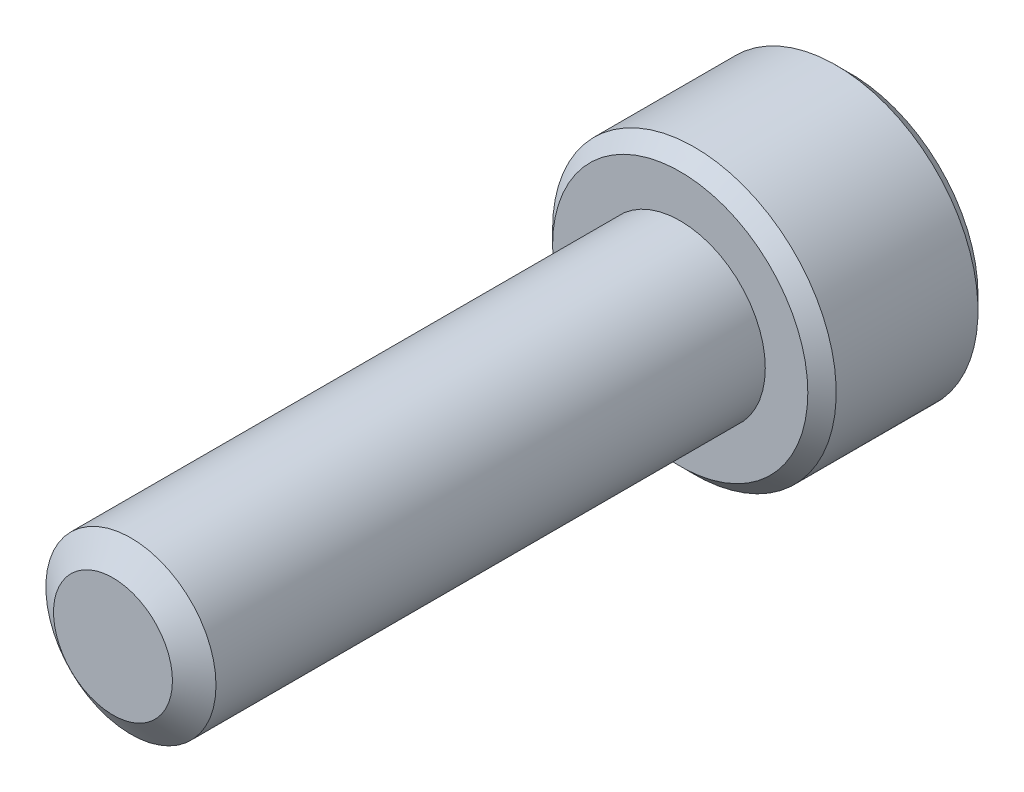
ISO-10303-21;
HEADER;
FILE_DESCRIPTION(('STEP AP214'),'2;1');
FILE_NAME('part.step','',(''),(''),'','','');
FILE_SCHEMA(('AUTOMOTIVE_DESIGN { 1 0 10303 214 1 1 1 1 }'));
ENDSEC;
DATA;
#1=APPLICATION_CONTEXT('core data for automotive mechanical design processes');
#2=APPLICATION_PROTOCOL_DEFINITION('international standard','automotive_design',2000,#1);
#3=PRODUCT_CONTEXT('',#1,'mechanical');
#4=PRODUCT('Part','Part','',(#3));
#5=PRODUCT_RELATED_PRODUCT_CATEGORY('part','',(#4));
#6=PRODUCT_DEFINITION_FORMATION('','',#4);
#7=PRODUCT_DEFINITION_CONTEXT('part definition',#1,'design');
#8=PRODUCT_DEFINITION('design','',#6,#7);
#9=PRODUCT_DEFINITION_SHAPE('','',#8);
#10=(LENGTH_UNIT() NAMED_UNIT(*) SI_UNIT(.MILLI.,.METRE.));
#11=(NAMED_UNIT(*) PLANE_ANGLE_UNIT() SI_UNIT($,.RADIAN.));
#12=(NAMED_UNIT(*) SI_UNIT($,.STERADIAN.) SOLID_ANGLE_UNIT());
#13=UNCERTAINTY_MEASURE_WITH_UNIT(LENGTH_MEASURE(1.E-05),#10,'distance_accuracy_value','');
#14=(GEOMETRIC_REPRESENTATION_CONTEXT(3) GLOBAL_UNCERTAINTY_ASSIGNED_CONTEXT((#13)) GLOBAL_UNIT_ASSIGNED_CONTEXT((#10,
#11,#12)) REPRESENTATION_CONTEXT('',''));
#15=CARTESIAN_POINT('',(0.,0.,0.));
#16=DIRECTION('',(0.,0.,1.));
#17=DIRECTION('',(1.,0.,0.));
#18=AXIS2_PLACEMENT_3D('',#15,#16,#17);
#19=CARTESIAN_POINT('',(0.,0.,-20.));
#20=DIRECTION('',(0.,0.,1.));
#21=DIRECTION('',(1.,0.,0.));
#22=AXIS2_PLACEMENT_3D('',#19,#20,#21);
#23=CYLINDRICAL_SURFACE('',#22,3.);
#24=CARTESIAN_POINT('',(0.,0.,-20.));
#25=DIRECTION('',(0.,0.,-1.));
#26=DIRECTION('',(-1.,0.,0.));
#27=AXIS2_PLACEMENT_3D('',#24,#25,#26);
#28=CIRCLE('',#27,3.);
#29=CARTESIAN_POINT('',(-3.,0.,-20.));
#30=VERTEX_POINT('',#29);
#31=EDGE_CURVE('E154',#30,#30,#28,.F.);
#32=ORIENTED_EDGE('',*,*,#31,.T.);
#33=EDGE_LOOP('',(#32));
#34=FACE_BOUND('',#33,.T.);
#35=CARTESIAN_POINT('',(0.,0.,-0.632650851713494));
#36=DIRECTION('',(0.,0.,1.));
#37=DIRECTION('',(1.,0.,0.));
#38=AXIS2_PLACEMENT_3D('',#35,#36,#37);
#39=CIRCLE('',#38,3.);
#40=CARTESIAN_POINT('',(3.,0.,-0.632650851713494));
#41=VERTEX_POINT('',#40);
#42=EDGE_CURVE('E171',#41,#41,#39,.T.);
#43=ORIENTED_EDGE('',*,*,#42,.F.);
#44=EDGE_LOOP('',(#43));
#45=FACE_BOUND('',#44,.T.);
#46=ADVANCED_FACE('F39',(#34,#45),#23,.T.);
#47=CARTESIAN_POINT('',(0.,0.,0.));
#48=DIRECTION('',(0.,0.,-1.));
#49=DIRECTION('',(-1.,0.,0.));
#50=AXIS2_PLACEMENT_3D('',#47,#48,#49);
#51=CONICAL_SURFACE('',#50,2.09648094716167,0.959931088596884);
#52=ORIENTED_EDGE('',*,*,#42,.T.);
#53=EDGE_LOOP('',(#52));
#54=FACE_BOUND('',#53,.T.);
#55=CARTESIAN_POINT('',(0.,0.,0.));
#56=DIRECTION('',(0.,0.,1.));
#57=DIRECTION('',(1.,0.,0.));
#58=AXIS2_PLACEMENT_3D('',#55,#56,#57);
#59=CIRCLE('',#58,2.09648094716167);
#60=CARTESIAN_POINT('',(2.09648094716167,0.,0.));
#61=VERTEX_POINT('',#60);
#62=EDGE_CURVE('E167',#61,#61,#59,.T.);
#63=ORIENTED_EDGE('',*,*,#62,.F.);
#64=EDGE_LOOP('',(#63));
#65=FACE_BOUND('',#64,.T.);
#66=ADVANCED_FACE('F220',(#54,#65),#51,.T.);
#67=CARTESIAN_POINT('',(0.,0.,0.));
#68=DIRECTION('',(0.,0.,1.));
#69=DIRECTION('',(1.,0.,0.));
#70=AXIS2_PLACEMENT_3D('',#67,#68,#69);
#71=PLANE('',#70);
#72=ORIENTED_EDGE('',*,*,#62,.T.);
#73=EDGE_LOOP('',(#72));
#74=FACE_BOUND('',#73,.T.);
#75=ADVANCED_FACE('F226',(#74),#71,.T.);
#76=CARTESIAN_POINT('',(0.,0.,-26.));
#77=DIRECTION('',(0.,0.,1.));
#78=DIRECTION('',(1.,0.,0.));
#79=AXIS2_PLACEMENT_3D('',#76,#77,#78);
#80=CYLINDRICAL_SURFACE('',#79,5.);
#81=CARTESIAN_POINT('',(0.,0.,-25.5));
#82=DIRECTION('',(0.,0.,-1.));
#83=DIRECTION('',(-1.,0.,0.));
#84=AXIS2_PLACEMENT_3D('',#81,#82,#83);
#85=CIRCLE('',#84,5.);
#86=CARTESIAN_POINT('',(-5.,0.,-25.5));
#87=VERTEX_POINT('',#86);
#88=EDGE_CURVE('E48',#87,#87,#85,.F.);
#89=ORIENTED_EDGE('',*,*,#88,.T.);
#90=EDGE_LOOP('',(#89));
#91=FACE_BOUND('',#90,.T.);
#92=CARTESIAN_POINT('',(0.,0.,-20.5));
#93=DIRECTION('',(0.,0.,-1.));
#94=DIRECTION('',(-1.,0.,0.));
#95=AXIS2_PLACEMENT_3D('',#92,#93,#94);
#96=CIRCLE('',#95,5.);
#97=CARTESIAN_POINT('',(-5.,0.,-20.5));
#98=VERTEX_POINT('',#97);
#99=EDGE_CURVE('E179',#98,#98,#96,.T.);
#100=ORIENTED_EDGE('',*,*,#99,.T.);
#101=EDGE_LOOP('',(#100));
#102=FACE_BOUND('',#101,.T.);
#103=ADVANCED_FACE('F186',(#91,#102),#80,.T.);
#104=CARTESIAN_POINT('',(0.,0.,-26.));
#105=DIRECTION('',(0.,0.,-1.));
#106=DIRECTION('',(-1.,0.,0.));
#107=AXIS2_PLACEMENT_3D('',#104,#105,#106);
#108=PLANE('',#107);
#109=CARTESIAN_POINT('',(0.,0.,-26.));
#110=DIRECTION('',(0.,0.,-1.));
#111=DIRECTION('',(-1.,0.,0.));
#112=AXIS2_PLACEMENT_3D('',#109,#110,#111);
#113=CIRCLE('',#112,4.5);
#114=CARTESIAN_POINT('',(-4.5,0.,-26.));
#115=VERTEX_POINT('',#114);
#116=EDGE_CURVE('E175',#115,#115,#113,.T.);
#117=ORIENTED_EDGE('',*,*,#116,.T.);
#118=EDGE_LOOP('',(#117));
#119=FACE_BOUND('',#118,.T.);
#120=DIRECTION('',(0.866025403784439,0.5,0.));
#121=VECTOR('',#120,1.);
#122=CARTESIAN_POINT('',(-2.5,1.44337567297406,-26.));
#123=LINE('',#122,#121);
#124=CARTESIAN_POINT('',(-2.5,1.44337567297406,-26.));
#125=VERTEX_POINT('',#124);
#126=CARTESIAN_POINT('',(0.,2.88675134594813,-26.));
#127=VERTEX_POINT('',#126);
#128=EDGE_CURVE('E55',#125,#127,#123,.T.);
#129=ORIENTED_EDGE('',*,*,#128,.F.);
#130=DIRECTION('',(0.,1.,0.));
#131=VECTOR('',#130,1.);
#132=CARTESIAN_POINT('',(-2.5,-1.44337567297406,-26.));
#133=LINE('',#132,#131);
#134=CARTESIAN_POINT('',(-2.5,-1.44337567297406,-26.));
#135=VERTEX_POINT('',#134);
#136=EDGE_CURVE('E148',#135,#125,#133,.T.);
#137=ORIENTED_EDGE('',*,*,#136,.F.);
#138=DIRECTION('',(-0.866025403784439,0.5,0.));
#139=VECTOR('',#138,1.);
#140=CARTESIAN_POINT('',(0.,-2.88675134594813,-26.));
#141=LINE('',#140,#139);
#142=CARTESIAN_POINT('',(0.,-2.88675134594813,-26.));
#143=VERTEX_POINT('',#142);
#144=EDGE_CURVE('E145',#143,#135,#141,.T.);
#145=ORIENTED_EDGE('',*,*,#144,.F.);
#146=DIRECTION('',(-0.866025403784439,-0.5,0.));
#147=VECTOR('',#146,1.);
#148=CARTESIAN_POINT('',(2.5,-1.44337567297407,-26.));
#149=LINE('',#148,#147);
#150=CARTESIAN_POINT('',(2.5,-1.44337567297407,-26.));
#151=VERTEX_POINT('',#150);
#152=EDGE_CURVE('E103',#151,#143,#149,.T.);
#153=ORIENTED_EDGE('',*,*,#152,.F.);
#154=DIRECTION('',(0.,-1.,0.));
#155=VECTOR('',#154,1.);
#156=CARTESIAN_POINT('',(2.5,1.44337567297406,-26.));
#157=LINE('',#156,#155);
#158=CARTESIAN_POINT('',(2.5,1.44337567297406,-26.));
#159=VERTEX_POINT('',#158);
#160=EDGE_CURVE('E139',#159,#151,#157,.T.);
#161=ORIENTED_EDGE('',*,*,#160,.F.);
#162=DIRECTION('',(0.866025403784439,-0.5,0.));
#163=VECTOR('',#162,1.);
#164=CARTESIAN_POINT('',(0.,2.88675134594813,-26.));
#165=LINE('',#164,#163);
#166=EDGE_CURVE('E135',#127,#159,#165,.T.);
#167=ORIENTED_EDGE('',*,*,#166,.F.);
#168=EDGE_LOOP('',(#129,#137,#145,#153,#161,#167));
#169=FACE_BOUND('',#168,.T.);
#170=ADVANCED_FACE('F194',(#119,#169),#108,.T.);
#171=CARTESIAN_POINT('',(0.,0.,-20.));
#172=DIRECTION('',(0.,0.,-1.));
#173=DIRECTION('',(-1.,0.,0.));
#174=AXIS2_PLACEMENT_3D('',#171,#172,#173);
#175=PLANE('',#174);
#176=CARTESIAN_POINT('',(0.,0.,-20.));
#177=DIRECTION('',(0.,0.,-1.));
#178=DIRECTION('',(-1.,0.,0.));
#179=AXIS2_PLACEMENT_3D('',#176,#177,#178);
#180=CIRCLE('',#179,4.5);
#181=CARTESIAN_POINT('',(-4.5,0.,-20.));
#182=VERTEX_POINT('',#181);
#183=EDGE_CURVE('E11',#182,#182,#180,.F.);
#184=ORIENTED_EDGE('',*,*,#183,.T.);
#185=EDGE_LOOP('',(#184));
#186=FACE_BOUND('',#185,.T.);
#187=ORIENTED_EDGE('',*,*,#31,.F.);
#188=EDGE_LOOP('',(#187));
#189=FACE_BOUND('',#188,.T.);
#190=ADVANCED_FACE('F197',(#186,#189),#175,.F.);
#191=CARTESIAN_POINT('',(-2.5,1.44337567297406,-22.25));
#192=DIRECTION('',(-0.5,0.866025403784439,0.));
#193=DIRECTION('',(-0.866025403784439,-0.5,0.));
#194=AXIS2_PLACEMENT_3D('',#191,#192,#193);
#195=PLANE('',#194);
#196=ORIENTED_EDGE('',*,*,#128,.T.);
#197=DIRECTION('',(0.,0.,-1.));
#198=VECTOR('',#197,1.);
#199=CARTESIAN_POINT('',(0.,2.88675134594813,-22.25));
#200=LINE('',#199,#198);
#201=CARTESIAN_POINT('',(0.,2.88675134594813,-22.25));
#202=VERTEX_POINT('',#201);
#203=EDGE_CURVE('E85',#202,#127,#200,.T.);
#204=ORIENTED_EDGE('',*,*,#203,.F.);
#205=DIRECTION('',(0.866025403784439,0.5,0.));
#206=VECTOR('',#205,1.);
#207=CARTESIAN_POINT('',(-2.5,1.44337567297406,-22.25));
#208=LINE('',#207,#206);
#209=CARTESIAN_POINT('',(-2.5,1.44337567297406,-22.25));
#210=VERTEX_POINT('',#209);
#211=EDGE_CURVE('E151',#210,#202,#208,.T.);
#212=ORIENTED_EDGE('',*,*,#211,.F.);
#213=DIRECTION('',(0.,0.,-1.));
#214=VECTOR('',#213,1.);
#215=CARTESIAN_POINT('',(-2.5,1.44337567297406,-22.25));
#216=LINE('',#215,#214);
#217=EDGE_CURVE('E63',#210,#125,#216,.T.);
#218=ORIENTED_EDGE('',*,*,#217,.T.);
#219=EDGE_LOOP('',(#196,#204,#212,#218));
#220=FACE_BOUND('',#219,.T.);
#221=ADVANCED_FACE('F207',(#220),#195,.F.);
#222=CARTESIAN_POINT('',(-2.5,-1.44337567297406,-22.25));
#223=DIRECTION('',(-1.,0.,0.));
#224=DIRECTION('',(0.,-1.,0.));
#225=AXIS2_PLACEMENT_3D('',#222,#223,#224);
#226=PLANE('',#225);
#227=ORIENTED_EDGE('',*,*,#136,.T.);
#228=ORIENTED_EDGE('',*,*,#217,.F.);
#229=DIRECTION('',(0.,1.,0.));
#230=VECTOR('',#229,1.);
#231=CARTESIAN_POINT('',(-2.5,-1.44337567297406,-22.25));
#232=LINE('',#231,#230);
#233=CARTESIAN_POINT('',(-2.5,-1.44337567297406,-22.25));
#234=VERTEX_POINT('',#233);
#235=EDGE_CURVE('E117',#234,#210,#232,.T.);
#236=ORIENTED_EDGE('',*,*,#235,.F.);
#237=DIRECTION('',(0.,0.,-1.));
#238=VECTOR('',#237,1.);
#239=CARTESIAN_POINT('',(-2.5,-1.44337567297406,-22.25));
#240=LINE('',#239,#238);
#241=EDGE_CURVE('E108',#234,#135,#240,.T.);
#242=ORIENTED_EDGE('',*,*,#241,.T.);
#243=EDGE_LOOP('',(#227,#228,#236,#242));
#244=FACE_BOUND('',#243,.T.);
#245=ADVANCED_FACE('F209',(#244),#226,.F.);
#246=CARTESIAN_POINT('',(0.,-2.88675134594813,-22.25));
#247=DIRECTION('',(-0.5,-0.866025403784439,0.));
#248=DIRECTION('',(0.866025403784439,-0.5,0.));
#249=AXIS2_PLACEMENT_3D('',#246,#247,#248);
#250=PLANE('',#249);
#251=ORIENTED_EDGE('',*,*,#144,.T.);
#252=ORIENTED_EDGE('',*,*,#241,.F.);
#253=DIRECTION('',(-0.866025403784439,0.5,0.));
#254=VECTOR('',#253,1.);
#255=CARTESIAN_POINT('',(0.,-2.88675134594813,-22.25));
#256=LINE('',#255,#254);
#257=CARTESIAN_POINT('',(0.,-2.88675134594813,-22.25));
#258=VERTEX_POINT('',#257);
#259=EDGE_CURVE('E112',#258,#234,#256,.T.);
#260=ORIENTED_EDGE('',*,*,#259,.F.);
#261=DIRECTION('',(0.,0.,-1.));
#262=VECTOR('',#261,1.);
#263=CARTESIAN_POINT('',(0.,-2.88675134594813,-22.25));
#264=LINE('',#263,#262);
#265=EDGE_CURVE('E96',#258,#143,#264,.T.);
#266=ORIENTED_EDGE('',*,*,#265,.T.);
#267=EDGE_LOOP('',(#251,#252,#260,#266));
#268=FACE_BOUND('',#267,.T.);
#269=ADVANCED_FACE('F113',(#268),#250,.F.);
#270=CARTESIAN_POINT('',(2.5,-1.44337567297407,-22.25));
#271=DIRECTION('',(0.5,-0.866025403784439,0.));
#272=DIRECTION('',(0.866025403784439,0.5,0.));
#273=AXIS2_PLACEMENT_3D('',#270,#271,#272);
#274=PLANE('',#273);
#275=ORIENTED_EDGE('',*,*,#152,.T.);
#276=ORIENTED_EDGE('',*,*,#265,.F.);
#277=DIRECTION('',(-0.866025403784439,-0.5,0.));
#278=VECTOR('',#277,1.);
#279=CARTESIAN_POINT('',(2.5,-1.44337567297407,-22.25));
#280=LINE('',#279,#278);
#281=CARTESIAN_POINT('',(2.5,-1.44337567297407,-22.25));
#282=VERTEX_POINT('',#281);
#283=EDGE_CURVE('E100',#282,#258,#280,.T.);
#284=ORIENTED_EDGE('',*,*,#283,.F.);
#285=DIRECTION('',(0.,0.,-1.));
#286=VECTOR('',#285,1.);
#287=CARTESIAN_POINT('',(2.5,-1.44337567297407,-22.25));
#288=LINE('',#287,#286);
#289=EDGE_CURVE('E109',#282,#151,#288,.T.);
#290=ORIENTED_EDGE('',*,*,#289,.T.);
#291=EDGE_LOOP('',(#275,#276,#284,#290));
#292=FACE_BOUND('',#291,.T.);
#293=ADVANCED_FACE('F98',(#292),#274,.F.);
#294=CARTESIAN_POINT('',(2.5,1.44337567297406,-22.25));
#295=DIRECTION('',(1.,0.,0.));
#296=DIRECTION('',(0.,0.,-1.));
#297=AXIS2_PLACEMENT_3D('',#294,#295,#296);
#298=PLANE('',#297);
#299=ORIENTED_EDGE('',*,*,#160,.T.);
#300=ORIENTED_EDGE('',*,*,#289,.F.);
#301=DIRECTION('',(0.,-1.,0.));
#302=VECTOR('',#301,1.);
#303=CARTESIAN_POINT('',(2.5,1.44337567297406,-22.25));
#304=LINE('',#303,#302);
#305=CARTESIAN_POINT('',(2.5,1.44337567297406,-22.25));
#306=VERTEX_POINT('',#305);
#307=EDGE_CURVE('E123',#306,#282,#304,.T.);
#308=ORIENTED_EDGE('',*,*,#307,.F.);
#309=DIRECTION('',(0.,0.,-1.));
#310=VECTOR('',#309,1.);
#311=CARTESIAN_POINT('',(2.5,1.44337567297406,-22.25));
#312=LINE('',#311,#310);
#313=EDGE_CURVE('E159',#306,#159,#312,.T.);
#314=ORIENTED_EDGE('',*,*,#313,.T.);
#315=EDGE_LOOP('',(#299,#300,#308,#314));
#316=FACE_BOUND('',#315,.T.);
#317=ADVANCED_FACE('F281',(#316),#298,.F.);
#318=CARTESIAN_POINT('',(0.,2.88675134594813,-22.25));
#319=DIRECTION('',(0.5,0.866025403784439,0.));
#320=DIRECTION('',(-0.866025403784439,0.5,0.));
#321=AXIS2_PLACEMENT_3D('',#318,#319,#320);
#322=PLANE('',#321);
#323=ORIENTED_EDGE('',*,*,#166,.T.);
#324=ORIENTED_EDGE('',*,*,#313,.F.);
#325=DIRECTION('',(0.866025403784439,-0.5,0.));
#326=VECTOR('',#325,1.);
#327=CARTESIAN_POINT('',(0.,2.88675134594813,-22.25));
#328=LINE('',#327,#326);
#329=EDGE_CURVE('E127',#202,#306,#328,.T.);
#330=ORIENTED_EDGE('',*,*,#329,.F.);
#331=ORIENTED_EDGE('',*,*,#203,.T.);
#332=EDGE_LOOP('',(#323,#324,#330,#331));
#333=FACE_BOUND('',#332,.T.);
#334=ADVANCED_FACE('F203',(#333),#322,.F.);
#335=CARTESIAN_POINT('',(2.5,4.33012701892219,-22.25));
#336=DIRECTION('',(0.,0.,-1.));
#337=DIRECTION('',(-1.,0.,0.));
#338=AXIS2_PLACEMENT_3D('',#335,#336,#337);
#339=PLANE('',#338);
#340=ORIENTED_EDGE('',*,*,#211,.T.);
#341=ORIENTED_EDGE('',*,*,#329,.T.);
#342=ORIENTED_EDGE('',*,*,#307,.T.);
#343=ORIENTED_EDGE('',*,*,#283,.T.);
#344=ORIENTED_EDGE('',*,*,#259,.T.);
#345=ORIENTED_EDGE('',*,*,#235,.T.);
#346=EDGE_LOOP('',(#340,#341,#342,#343,#344,#345));
#347=FACE_BOUND('',#346,.T.);
#348=ADVANCED_FACE('F120',(#347),#339,.T.);
#349=CARTESIAN_POINT('',(0.,0.,-26.));
#350=DIRECTION('',(0.,0.,1.));
#351=DIRECTION('',(1.,0.,0.));
#352=AXIS2_PLACEMENT_3D('',#349,#350,#351);
#353=CONICAL_SURFACE('',#352,4.5,0.785398163397444);
#354=ORIENTED_EDGE('',*,*,#88,.F.);
#355=EDGE_LOOP('',(#354));
#356=FACE_BOUND('',#355,.T.);
#357=ORIENTED_EDGE('',*,*,#116,.F.);
#358=EDGE_LOOP('',(#357));
#359=FACE_BOUND('',#358,.T.);
#360=ADVANCED_FACE('F189',(#356,#359),#353,.T.);
#361=CARTESIAN_POINT('',(0.,0.,-20.5));
#362=DIRECTION('',(0.,0.,-1.));
#363=DIRECTION('',(-1.,0.,0.));
#364=AXIS2_PLACEMENT_3D('',#361,#362,#363);
#365=CONICAL_SURFACE('',#364,5.,0.785398163397451);
#366=ORIENTED_EDGE('',*,*,#183,.F.);
#367=EDGE_LOOP('',(#366));
#368=FACE_BOUND('',#367,.T.);
#369=ORIENTED_EDGE('',*,*,#99,.F.);
#370=EDGE_LOOP('',(#369));
#371=FACE_BOUND('',#370,.T.);
#372=ADVANCED_FACE('F41',(#368,#371),#365,.T.);
#373=CLOSED_SHELL('',(#46,#66,#75,#103,#170,#190,#221,#245,#269,#293,#317,#334,#348,#360,#372));
#374=MANIFOLD_SOLID_BREP('B2',#373);
#375=ADVANCED_BREP_SHAPE_REPRESENTATION('',(#18,#374),#14);
#376=SHAPE_DEFINITION_REPRESENTATION(#9,#375);
ENDSEC;
END-ISO-10303-21;
